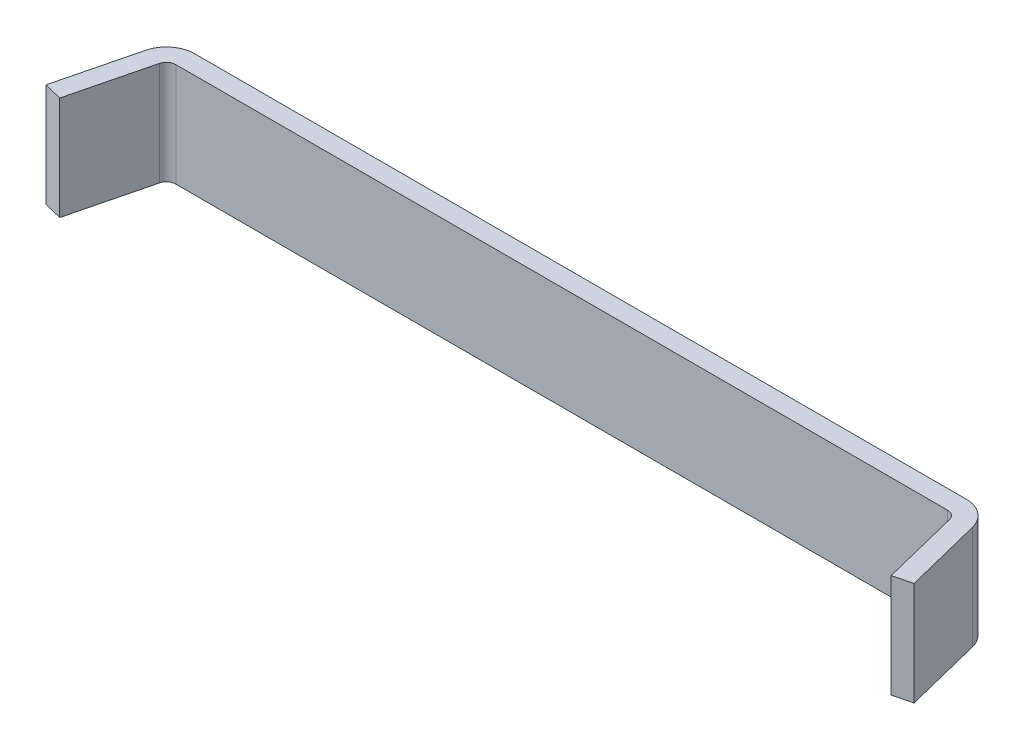
ISO-10303-21;
HEADER;
FILE_DESCRIPTION(('STEP AP214'),'2;1');
FILE_NAME('part.step','',(''),(''),'','','');
FILE_SCHEMA(('AUTOMOTIVE_DESIGN { 1 0 10303 214 1 1 1 1 }'));
ENDSEC;
DATA;
#1=APPLICATION_CONTEXT('core data for automotive mechanical design processes');
#2=APPLICATION_PROTOCOL_DEFINITION('international standard','automotive_design',2000,#1);
#3=PRODUCT_CONTEXT('',#1,'mechanical');
#4=PRODUCT('Part','Part','',(#3));
#5=PRODUCT_RELATED_PRODUCT_CATEGORY('part','',(#4));
#6=PRODUCT_DEFINITION_FORMATION('','',#4);
#7=PRODUCT_DEFINITION_CONTEXT('part definition',#1,'design');
#8=PRODUCT_DEFINITION('design','',#6,#7);
#9=PRODUCT_DEFINITION_SHAPE('','',#8);
#10=(LENGTH_UNIT() NAMED_UNIT(*) SI_UNIT(.MILLI.,.METRE.));
#11=(NAMED_UNIT(*) PLANE_ANGLE_UNIT() SI_UNIT($,.RADIAN.));
#12=(NAMED_UNIT(*) SI_UNIT($,.STERADIAN.) SOLID_ANGLE_UNIT());
#13=UNCERTAINTY_MEASURE_WITH_UNIT(LENGTH_MEASURE(1.E-05),#10,'distance_accuracy_value','');
#14=(GEOMETRIC_REPRESENTATION_CONTEXT(3) GLOBAL_UNCERTAINTY_ASSIGNED_CONTEXT((#13)) GLOBAL_UNIT_ASSIGNED_CONTEXT((#10,
#11,#12)) REPRESENTATION_CONTEXT('',''));
#15=CARTESIAN_POINT('',(0.,0.,0.));
#16=DIRECTION('',(0.,0.,1.));
#17=DIRECTION('',(1.,0.,0.));
#18=AXIS2_PLACEMENT_3D('',#15,#16,#17);
#19=CARTESIAN_POINT('',(1.2323153207,-0.275,0.36851171566));
#20=DIRECTION('',(-0.970295726275919,0.,0.24192189559998));
#21=DIRECTION('',(0.,1.,0.));
#22=AXIS2_PLACEMENT_3D('',#19,#20,#21);
#23=PLANE('',#22);
#24=DIRECTION('',(0.,-1.,0.));
#25=VECTOR('',#24,1.);
#26=CARTESIAN_POINT('',(1.335217773875,-0.275,0.781230912868));
#27=LINE('',#26,#25);
#28=CARTESIAN_POINT('',(1.335217773875,0.275,0.781230912868));
#29=VERTEX_POINT('',#28);
#30=CARTESIAN_POINT('',(1.335217773875,-0.275,0.781230912868));
#31=VERTEX_POINT('',#30);
#32=EDGE_CURVE('E11',#29,#31,#27,.T.);
#33=ORIENTED_EDGE('',*,*,#32,.T.);
#34=DIRECTION('',(-0.24192189559998,0.,-0.970295726275919));
#35=VECTOR('',#34,1.);
#36=CARTESIAN_POINT('',(1.335217773875,-0.275,0.781230912868));
#37=LINE('',#36,#35);
#38=CARTESIAN_POINT('',(1.2323153207,-0.275,0.36851171566));
#39=VERTEX_POINT('',#38);
#40=EDGE_CURVE('E142',#31,#39,#37,.T.);
#41=ORIENTED_EDGE('',*,*,#40,.T.);
#42=DIRECTION('',(0.,-1.,0.));
#43=VECTOR('',#42,1.);
#44=CARTESIAN_POINT('',(1.2323153207,-0.275,0.36851171566));
#45=LINE('',#44,#43);
#46=CARTESIAN_POINT('',(1.2323153207,0.275,0.36851171566));
#47=VERTEX_POINT('',#46);
#48=EDGE_CURVE('E136',#47,#39,#45,.T.);
#49=ORIENTED_EDGE('',*,*,#48,.F.);
#50=DIRECTION('',(0.24192189559998,0.,0.970295726275919));
#51=VECTOR('',#50,1.);
#52=CARTESIAN_POINT('',(1.2323153207,0.275,0.36851171566));
#53=LINE('',#52,#51);
#54=EDGE_CURVE('E139',#47,#29,#53,.T.);
#55=ORIENTED_EDGE('',*,*,#54,.T.);
#56=EDGE_LOOP('',(#33,#41,#49,#55));
#57=FACE_BOUND('',#56,.T.);
#58=ADVANCED_FACE('F17',(#57),#23,.F.);
#59=CARTESIAN_POINT('',(1.335217773875,-0.275,0.781230912868));
#60=DIRECTION('',(-0.24192189559998,0.,-0.970295726275919));
#61=DIRECTION('',(-0.970295726275919,0.,0.24192189559998));
#62=AXIS2_PLACEMENT_3D('',#59,#60,#61);
#63=PLANE('',#62);
#64=DIRECTION('',(0.,-1.,0.));
#65=VECTOR('',#64,1.);
#66=CARTESIAN_POINT('',(1.238188201247,-0.275,0.805423102428));
#67=LINE('',#66,#65);
#68=CARTESIAN_POINT('',(1.238188201247,0.275,0.805423102428));
#69=VERTEX_POINT('',#68);
#70=CARTESIAN_POINT('',(1.238188201247,-0.275,0.805423102428));
#71=VERTEX_POINT('',#70);
#72=EDGE_CURVE('E25',#69,#71,#67,.T.);
#73=ORIENTED_EDGE('',*,*,#72,.T.);
#74=DIRECTION('',(0.970295726275919,0.,-0.24192189559998));
#75=VECTOR('',#74,1.);
#76=CARTESIAN_POINT('',(1.238188201247,-0.275,0.805423102428));
#77=LINE('',#76,#75);
#78=EDGE_CURVE('E234',#71,#31,#77,.T.);
#79=ORIENTED_EDGE('',*,*,#78,.T.);
#80=ORIENTED_EDGE('',*,*,#32,.F.);
#81=DIRECTION('',(-0.970295726275919,0.,0.24192189559998));
#82=VECTOR('',#81,1.);
#83=CARTESIAN_POINT('',(1.335217773875,0.275,0.781230912868));
#84=LINE('',#83,#82);
#85=EDGE_CURVE('E162',#29,#69,#84,.T.);
#86=ORIENTED_EDGE('',*,*,#85,.T.);
#87=EDGE_LOOP('',(#73,#79,#80,#86));
#88=FACE_BOUND('',#87,.T.);
#89=ADVANCED_FACE('F272',(#88),#63,.F.);
#90=CARTESIAN_POINT('',(1.238188201247,-0.275,0.805423102428));
#91=DIRECTION('',(0.970295726275919,0.,-0.24192189559998));
#92=DIRECTION('',(0.,-1.,0.));
#93=AXIS2_PLACEMENT_3D('',#90,#91,#92);
#94=PLANE('',#93);
#95=DIRECTION('',(0.,-1.,0.));
#96=VECTOR('',#95,1.);
#97=CARTESIAN_POINT('',(1.135285748072,-0.275,0.39270390522));
#98=LINE('',#97,#96);
#99=CARTESIAN_POINT('',(1.135285748072,0.275,0.39270390522));
#100=VERTEX_POINT('',#99);
#101=CARTESIAN_POINT('',(1.135285748072,-0.275,0.39270390522));
#102=VERTEX_POINT('',#101);
#103=EDGE_CURVE('E266',#100,#102,#98,.T.);
#104=ORIENTED_EDGE('',*,*,#103,.T.);
#105=DIRECTION('',(0.24192189559998,0.,0.970295726275919));
#106=VECTOR('',#105,1.);
#107=CARTESIAN_POINT('',(1.135285748072,-0.275,0.39270390522));
#108=LINE('',#107,#106);
#109=EDGE_CURVE('E238',#102,#71,#108,.T.);
#110=ORIENTED_EDGE('',*,*,#109,.T.);
#111=ORIENTED_EDGE('',*,*,#72,.F.);
#112=DIRECTION('',(-0.24192189559998,0.,-0.970295726275919));
#113=VECTOR('',#112,1.);
#114=CARTESIAN_POINT('',(1.238188201247,0.275,0.805423102428));
#115=LINE('',#114,#113);
#116=EDGE_CURVE('E169',#69,#100,#115,.T.);
#117=ORIENTED_EDGE('',*,*,#116,.T.);
#118=EDGE_LOOP('',(#104,#110,#111,#117));
#119=FACE_BOUND('',#118,.T.);
#120=ADVANCED_FACE('F276',(#119),#94,.F.);
#121=CARTESIAN_POINT('',(1.086770961758,-0.275,0.4048));
#122=DIRECTION('',(0.,1.,0.));
#123=DIRECTION('',(0.,0.,1.));
#124=AXIS2_PLACEMENT_3D('',#121,#122,#123);
#125=CYLINDRICAL_SURFACE('',#124,0.05);
#126=DIRECTION('',(0.,1.,0.));
#127=VECTOR('',#126,1.);
#128=CARTESIAN_POINT('',(1.086770961758,-0.275,0.3548));
#129=LINE('',#128,#127);
#130=CARTESIAN_POINT('',(1.086770961758,-0.275,0.3548));
#131=VERTEX_POINT('',#130);
#132=CARTESIAN_POINT('',(1.086770961758,0.275,0.3548));
#133=VERTEX_POINT('',#132);
#134=EDGE_CURVE('E209',#131,#133,#129,.T.);
#135=ORIENTED_EDGE('',*,*,#134,.F.);
#136=CARTESIAN_POINT('',(1.086770961758,-0.275,0.4048));
#137=DIRECTION('',(0.,-1.,0.));
#138=DIRECTION('',(0.,0.,1.));
#139=AXIS2_PLACEMENT_3D('',#136,#137,#138);
#140=CIRCLE('',#139,0.05);
#141=EDGE_CURVE('E242',#131,#102,#140,.T.);
#142=ORIENTED_EDGE('',*,*,#141,.T.);
#143=ORIENTED_EDGE('',*,*,#103,.F.);
#144=CARTESIAN_POINT('',(1.086770961758,0.275,0.4048));
#145=DIRECTION('',(0.,1.,0.));
#146=DIRECTION('',(0.,0.,1.));
#147=AXIS2_PLACEMENT_3D('',#144,#145,#146);
#148=CIRCLE('',#147,0.05);
#149=EDGE_CURVE('E222',#100,#133,#148,.T.);
#150=ORIENTED_EDGE('',*,*,#149,.T.);
#151=EDGE_LOOP('',(#135,#142,#143,#150));
#152=FACE_BOUND('',#151,.T.);
#153=ADVANCED_FACE('F306',(#152),#125,.F.);
#154=CARTESIAN_POINT('',(-3.013229038242,-0.275,0.3548));
#155=DIRECTION('',(0.,0.,1.));
#156=DIRECTION('',(1.,0.,0.));
#157=AXIS2_PLACEMENT_3D('',#154,#155,#156);
#158=PLANE('',#157);
#159=DIRECTION('',(1.,0.,0.));
#160=VECTOR('',#159,1.);
#161=CARTESIAN_POINT('',(-3.013229038242,-0.275,0.3548));
#162=LINE('',#161,#160);
#163=CARTESIAN_POINT('',(-3.013229038242,-0.275,0.3548));
#164=VERTEX_POINT('',#163);
#165=EDGE_CURVE('E246',#164,#131,#162,.T.);
#166=ORIENTED_EDGE('',*,*,#165,.T.);
#167=ORIENTED_EDGE('',*,*,#134,.T.);
#168=DIRECTION('',(-1.,0.,0.));
#169=VECTOR('',#168,1.);
#170=CARTESIAN_POINT('',(1.086770961758,0.275,0.3548));
#171=LINE('',#170,#169);
#172=CARTESIAN_POINT('',(-3.013229038242,0.275,0.3548));
#173=VERTEX_POINT('',#172);
#174=EDGE_CURVE('E218',#133,#173,#171,.T.);
#175=ORIENTED_EDGE('',*,*,#174,.T.);
#176=DIRECTION('',(0.,-1.,0.));
#177=VECTOR('',#176,1.);
#178=CARTESIAN_POINT('',(-3.013229038242,0.275,0.3548));
#179=LINE('',#178,#177);
#180=EDGE_CURVE('E206',#173,#164,#179,.T.);
#181=ORIENTED_EDGE('',*,*,#180,.T.);
#182=EDGE_LOOP('',(#166,#167,#175,#181));
#183=FACE_BOUND('',#182,.T.);
#184=ADVANCED_FACE('F303',(#183),#158,.T.);
#185=CARTESIAN_POINT('',(-3.013229038242,0.275,0.4048));
#186=DIRECTION('',(0.,-1.,0.));
#187=DIRECTION('',(0.,0.,-1.));
#188=AXIS2_PLACEMENT_3D('',#185,#186,#187);
#189=CYLINDRICAL_SURFACE('',#188,0.05);
#190=ORIENTED_EDGE('',*,*,#180,.F.);
#191=CARTESIAN_POINT('',(-3.013229038242,0.275,0.4048));
#192=DIRECTION('',(0.,1.,0.));
#193=DIRECTION('',(0.,0.,-1.));
#194=AXIS2_PLACEMENT_3D('',#191,#192,#193);
#195=CIRCLE('',#194,0.05);
#196=CARTESIAN_POINT('',(-3.061743824555,0.275,0.39270390522));
#197=VERTEX_POINT('',#196);
#198=EDGE_CURVE('E214',#173,#197,#195,.T.);
#199=ORIENTED_EDGE('',*,*,#198,.T.);
#200=DIRECTION('',(0.,-1.,0.));
#201=VECTOR('',#200,1.);
#202=CARTESIAN_POINT('',(-3.061743824555,0.275,0.39270390522));
#203=LINE('',#202,#201);
#204=CARTESIAN_POINT('',(-3.061743824555,-0.275,0.39270390522));
#205=VERTEX_POINT('',#204);
#206=EDGE_CURVE('E210',#197,#205,#203,.T.);
#207=ORIENTED_EDGE('',*,*,#206,.T.);
#208=CARTESIAN_POINT('',(-3.013229038242,-0.275,0.4048));
#209=DIRECTION('',(0.,-1.,0.));
#210=DIRECTION('',(0.,0.,-1.));
#211=AXIS2_PLACEMENT_3D('',#208,#209,#210);
#212=CIRCLE('',#211,0.05);
#213=EDGE_CURVE('E185',#205,#164,#212,.T.);
#214=ORIENTED_EDGE('',*,*,#213,.T.);
#215=EDGE_LOOP('',(#190,#199,#207,#214));
#216=FACE_BOUND('',#215,.T.);
#217=ADVANCED_FACE('F300',(#216),#189,.F.);
#218=CARTESIAN_POINT('',(-3.167549340477,0.275,0.817066651143));
#219=DIRECTION('',(-0.970295726275919,0.,-0.24192189559998));
#220=DIRECTION('',(-0.24192189559998,0.,0.970295726275919));
#221=AXIS2_PLACEMENT_3D('',#218,#219,#220);
#222=PLANE('',#221);
#223=ORIENTED_EDGE('',*,*,#206,.F.);
#224=DIRECTION('',(-0.24192189559998,0.,0.970295726275919));
#225=VECTOR('',#224,1.);
#226=CARTESIAN_POINT('',(-3.061743824555,0.275,0.39270390522));
#227=LINE('',#226,#225);
#228=CARTESIAN_POINT('',(-3.167549340477,0.275,0.817066651143));
#229=VERTEX_POINT('',#228);
#230=EDGE_CURVE('E201',#197,#229,#227,.T.);
#231=ORIENTED_EDGE('',*,*,#230,.T.);
#232=DIRECTION('',(0.,-1.,0.));
#233=VECTOR('',#232,1.);
#234=CARTESIAN_POINT('',(-3.167549340477,0.275,0.817066651143));
#235=LINE('',#234,#233);
#236=CARTESIAN_POINT('',(-3.167549340477,-0.275,0.817066651143));
#237=VERTEX_POINT('',#236);
#238=EDGE_CURVE('E225',#229,#237,#235,.T.);
#239=ORIENTED_EDGE('',*,*,#238,.T.);
#240=DIRECTION('',(0.24192189559998,0.,-0.970295726275919));
#241=VECTOR('',#240,1.);
#242=CARTESIAN_POINT('',(-3.167549340477,-0.275,0.817066651143));
#243=LINE('',#242,#241);
#244=EDGE_CURVE('E180',#237,#205,#243,.T.);
#245=ORIENTED_EDGE('',*,*,#244,.T.);
#246=EDGE_LOOP('',(#223,#231,#239,#245));
#247=FACE_BOUND('',#246,.T.);
#248=ADVANCED_FACE('F296',(#247),#222,.F.);
#249=CARTESIAN_POINT('',(-3.264578913105,0.275,0.792874461583));
#250=DIRECTION('',(0.24192189559998,0.,-0.970295726275919));
#251=DIRECTION('',(0.,-1.,0.));
#252=AXIS2_PLACEMENT_3D('',#249,#250,#251);
#253=PLANE('',#252);
#254=ORIENTED_EDGE('',*,*,#238,.F.);
#255=DIRECTION('',(-0.970295726275919,0.,-0.24192189559998));
#256=VECTOR('',#255,1.);
#257=CARTESIAN_POINT('',(-3.167549340477,0.275,0.817066651143));
#258=LINE('',#257,#256);
#259=CARTESIAN_POINT('',(-3.264578913105,0.275,0.792874461583));
#260=VERTEX_POINT('',#259);
#261=EDGE_CURVE('E198',#229,#260,#258,.T.);
#262=ORIENTED_EDGE('',*,*,#261,.T.);
#263=DIRECTION('',(0.,-1.,0.));
#264=VECTOR('',#263,1.);
#265=CARTESIAN_POINT('',(-3.264578913105,0.275,0.792874461583));
#266=LINE('',#265,#264);
#267=CARTESIAN_POINT('',(-3.264578913105,-0.275,0.792874461583));
#268=VERTEX_POINT('',#267);
#269=EDGE_CURVE('E47',#260,#268,#266,.T.);
#270=ORIENTED_EDGE('',*,*,#269,.T.);
#271=DIRECTION('',(0.970295726275919,0.,0.24192189559998));
#272=VECTOR('',#271,1.);
#273=CARTESIAN_POINT('',(-3.264578913105,-0.275,0.792874461583));
#274=LINE('',#273,#272);
#275=EDGE_CURVE('E184',#268,#237,#274,.T.);
#276=ORIENTED_EDGE('',*,*,#275,.T.);
#277=EDGE_LOOP('',(#254,#262,#270,#276));
#278=FACE_BOUND('',#277,.T.);
#279=ADVANCED_FACE('F291',(#278),#253,.F.);
#280=CARTESIAN_POINT('',(-3.158773397183,0.275,0.36851171566));
#281=DIRECTION('',(0.970295726275919,0.,0.24192189559998));
#282=DIRECTION('',(0.,-1.,0.));
#283=AXIS2_PLACEMENT_3D('',#280,#281,#282);
#284=PLANE('',#283);
#285=ORIENTED_EDGE('',*,*,#269,.F.);
#286=DIRECTION('',(0.24192189559998,0.,-0.970295726275919));
#287=VECTOR('',#286,1.);
#288=CARTESIAN_POINT('',(-3.264578913105,0.275,0.792874461583));
#289=LINE('',#288,#287);
#290=CARTESIAN_POINT('',(-3.158773397183,0.275,0.36851171566));
#291=VERTEX_POINT('',#290);
#292=EDGE_CURVE('E178',#260,#291,#289,.T.);
#293=ORIENTED_EDGE('',*,*,#292,.T.);
#294=DIRECTION('',(0.,1.,0.));
#295=VECTOR('',#294,1.);
#296=CARTESIAN_POINT('',(-3.158773397183,0.275,0.36851171566));
#297=LINE('',#296,#295);
#298=CARTESIAN_POINT('',(-3.158773397183,-0.275,0.36851171566));
#299=VERTEX_POINT('',#298);
#300=EDGE_CURVE('E37',#299,#291,#297,.T.);
#301=ORIENTED_EDGE('',*,*,#300,.F.);
#302=DIRECTION('',(-0.24192189559998,0.,0.970295726275919));
#303=VECTOR('',#302,1.);
#304=CARTESIAN_POINT('',(-3.158773397183,-0.275,0.36851171566));
#305=LINE('',#304,#303);
#306=EDGE_CURVE('E192',#299,#268,#305,.T.);
#307=ORIENTED_EDGE('',*,*,#306,.T.);
#308=EDGE_LOOP('',(#285,#293,#301,#307));
#309=FACE_BOUND('',#308,.T.);
#310=ADVANCED_FACE('F289',(#309),#284,.F.);
#311=CARTESIAN_POINT('',(-3.013229038242,0.275,0.4048));
#312=DIRECTION('',(0.,-1.,0.));
#313=DIRECTION('',(0.,0.,-1.));
#314=AXIS2_PLACEMENT_3D('',#311,#312,#313);
#315=CYLINDRICAL_SURFACE('',#314,0.15);
#316=CARTESIAN_POINT('',(-3.013229038242,0.275,0.4048));
#317=DIRECTION('',(0.,-1.,0.));
#318=DIRECTION('',(0.,0.,-1.));
#319=AXIS2_PLACEMENT_3D('',#316,#317,#318);
#320=CIRCLE('',#319,0.15);
#321=CARTESIAN_POINT('',(-3.013229038242,0.275,0.2548));
#322=VERTEX_POINT('',#321);
#323=EDGE_CURVE('E175',#291,#322,#320,.T.);
#324=ORIENTED_EDGE('',*,*,#323,.T.);
#325=DIRECTION('',(0.,-1.,0.));
#326=VECTOR('',#325,1.);
#327=CARTESIAN_POINT('',(-3.013229038242,-0.275,0.2548));
#328=LINE('',#327,#326);
#329=CARTESIAN_POINT('',(-3.013229038242,-0.275,0.2548));
#330=VERTEX_POINT('',#329);
#331=EDGE_CURVE('E189',#322,#330,#328,.T.);
#332=ORIENTED_EDGE('',*,*,#331,.T.);
#333=CARTESIAN_POINT('',(-3.013229038242,-0.275,0.4048));
#334=DIRECTION('',(0.,1.,0.));
#335=DIRECTION('',(0.,0.,-1.));
#336=AXIS2_PLACEMENT_3D('',#333,#334,#335);
#337=CIRCLE('',#336,0.15);
#338=EDGE_CURVE('E255',#330,#299,#337,.T.);
#339=ORIENTED_EDGE('',*,*,#338,.T.);
#340=ORIENTED_EDGE('',*,*,#300,.T.);
#341=EDGE_LOOP('',(#324,#332,#339,#340));
#342=FACE_BOUND('',#341,.T.);
#343=ADVANCED_FACE('F288',(#342),#315,.T.);
#344=CARTESIAN_POINT('',(-3.013229038242,-0.275,0.3548));
#345=DIRECTION('',(0.,1.,0.));
#346=DIRECTION('',(1.,0.,0.));
#347=AXIS2_PLACEMENT_3D('',#344,#345,#346);
#348=PLANE('',#347);
#349=CARTESIAN_POINT('',(1.086770961758,-0.275,0.4048));
#350=DIRECTION('',(0.,1.,0.));
#351=DIRECTION('',(0.,0.,1.));
#352=AXIS2_PLACEMENT_3D('',#349,#350,#351);
#353=CIRCLE('',#352,0.15);
#354=CARTESIAN_POINT('',(1.086770961758,-0.275,0.2548));
#355=VERTEX_POINT('',#354);
#356=EDGE_CURVE('E146',#39,#355,#353,.T.);
#357=ORIENTED_EDGE('',*,*,#356,.F.);
#358=ORIENTED_EDGE('',*,*,#40,.F.);
#359=ORIENTED_EDGE('',*,*,#78,.F.);
#360=ORIENTED_EDGE('',*,*,#109,.F.);
#361=ORIENTED_EDGE('',*,*,#141,.F.);
#362=ORIENTED_EDGE('',*,*,#165,.F.);
#363=ORIENTED_EDGE('',*,*,#213,.F.);
#364=ORIENTED_EDGE('',*,*,#244,.F.);
#365=ORIENTED_EDGE('',*,*,#275,.F.);
#366=ORIENTED_EDGE('',*,*,#306,.F.);
#367=ORIENTED_EDGE('',*,*,#338,.F.);
#368=DIRECTION('',(1.,0.,0.));
#369=VECTOR('',#368,1.);
#370=CARTESIAN_POINT('',(-3.013229038242,-0.275,0.2548));
#371=LINE('',#370,#369);
#372=EDGE_CURVE('E174',#330,#355,#371,.T.);
#373=ORIENTED_EDGE('',*,*,#372,.T.);
#374=EDGE_LOOP('',(#357,#358,#359,#360,#361,#362,#363,#364,#365,#366,#367,#373));
#375=FACE_BOUND('',#374,.T.);
#376=ADVANCED_FACE('F279',(#375),#348,.F.);
#377=CARTESIAN_POINT('',(1.086770961758,-0.275,0.4048));
#378=DIRECTION('',(0.,1.,0.));
#379=DIRECTION('',(0.,0.,1.));
#380=AXIS2_PLACEMENT_3D('',#377,#378,#379);
#381=CYLINDRICAL_SURFACE('',#380,0.15);
#382=ORIENTED_EDGE('',*,*,#356,.T.);
#383=DIRECTION('',(0.,1.,0.));
#384=VECTOR('',#383,1.);
#385=CARTESIAN_POINT('',(1.086770961758,-0.275,0.2548));
#386=LINE('',#385,#384);
#387=CARTESIAN_POINT('',(1.086770961758,0.275,0.2548));
#388=VERTEX_POINT('',#387);
#389=EDGE_CURVE('E152',#355,#388,#386,.T.);
#390=ORIENTED_EDGE('',*,*,#389,.T.);
#391=CARTESIAN_POINT('',(1.086770961758,0.275,0.4048));
#392=DIRECTION('',(0.,-1.,0.));
#393=DIRECTION('',(0.,0.,1.));
#394=AXIS2_PLACEMENT_3D('',#391,#392,#393);
#395=CIRCLE('',#394,0.15);
#396=EDGE_CURVE('E149',#388,#47,#395,.T.);
#397=ORIENTED_EDGE('',*,*,#396,.T.);
#398=ORIENTED_EDGE('',*,*,#48,.T.);
#399=EDGE_LOOP('',(#382,#390,#397,#398));
#400=FACE_BOUND('',#399,.T.);
#401=ADVANCED_FACE('F150',(#400),#381,.T.);
#402=CARTESIAN_POINT('',(1.086770961758,0.275,0.3548));
#403=DIRECTION('',(0.,-1.,0.));
#404=DIRECTION('',(0.,0.,-1.));
#405=AXIS2_PLACEMENT_3D('',#402,#403,#404);
#406=PLANE('',#405);
#407=ORIENTED_EDGE('',*,*,#323,.F.);
#408=ORIENTED_EDGE('',*,*,#292,.F.);
#409=ORIENTED_EDGE('',*,*,#261,.F.);
#410=ORIENTED_EDGE('',*,*,#230,.F.);
#411=ORIENTED_EDGE('',*,*,#198,.F.);
#412=ORIENTED_EDGE('',*,*,#174,.F.);
#413=ORIENTED_EDGE('',*,*,#149,.F.);
#414=ORIENTED_EDGE('',*,*,#116,.F.);
#415=ORIENTED_EDGE('',*,*,#85,.F.);
#416=ORIENTED_EDGE('',*,*,#54,.F.);
#417=ORIENTED_EDGE('',*,*,#396,.F.);
#418=DIRECTION('',(-1.,0.,0.));
#419=VECTOR('',#418,1.);
#420=CARTESIAN_POINT('',(-3.013229038242,0.275,0.2548));
#421=LINE('',#420,#419);
#422=EDGE_CURVE('E179',#388,#322,#421,.T.);
#423=ORIENTED_EDGE('',*,*,#422,.T.);
#424=EDGE_LOOP('',(#407,#408,#409,#410,#411,#412,#413,#414,#415,#416,#417,#423));
#425=FACE_BOUND('',#424,.T.);
#426=ADVANCED_FACE('F159',(#425),#406,.F.);
#427=CARTESIAN_POINT('',(-3.013229038242,-0.275,0.2548));
#428=DIRECTION('',(0.,0.,1.));
#429=DIRECTION('',(1.,0.,0.));
#430=AXIS2_PLACEMENT_3D('',#427,#428,#429);
#431=PLANE('',#430);
#432=ORIENTED_EDGE('',*,*,#389,.F.);
#433=ORIENTED_EDGE('',*,*,#372,.F.);
#434=ORIENTED_EDGE('',*,*,#331,.F.);
#435=ORIENTED_EDGE('',*,*,#422,.F.);
#436=EDGE_LOOP('',(#432,#433,#434,#435));
#437=FACE_BOUND('',#436,.T.);
#438=ADVANCED_FACE('F284',(#437),#431,.F.);
#439=CLOSED_SHELL('',(#58,#89,#120,#153,#184,#217,#248,#279,#310,#343,#376,#401,#426,#438));
#440=MANIFOLD_SOLID_BREP('B1',#439);
#441=ADVANCED_BREP_SHAPE_REPRESENTATION('',(#18,#440),#14);
#442=SHAPE_DEFINITION_REPRESENTATION(#9,#441);
ENDSEC;
END-ISO-10303-21;
